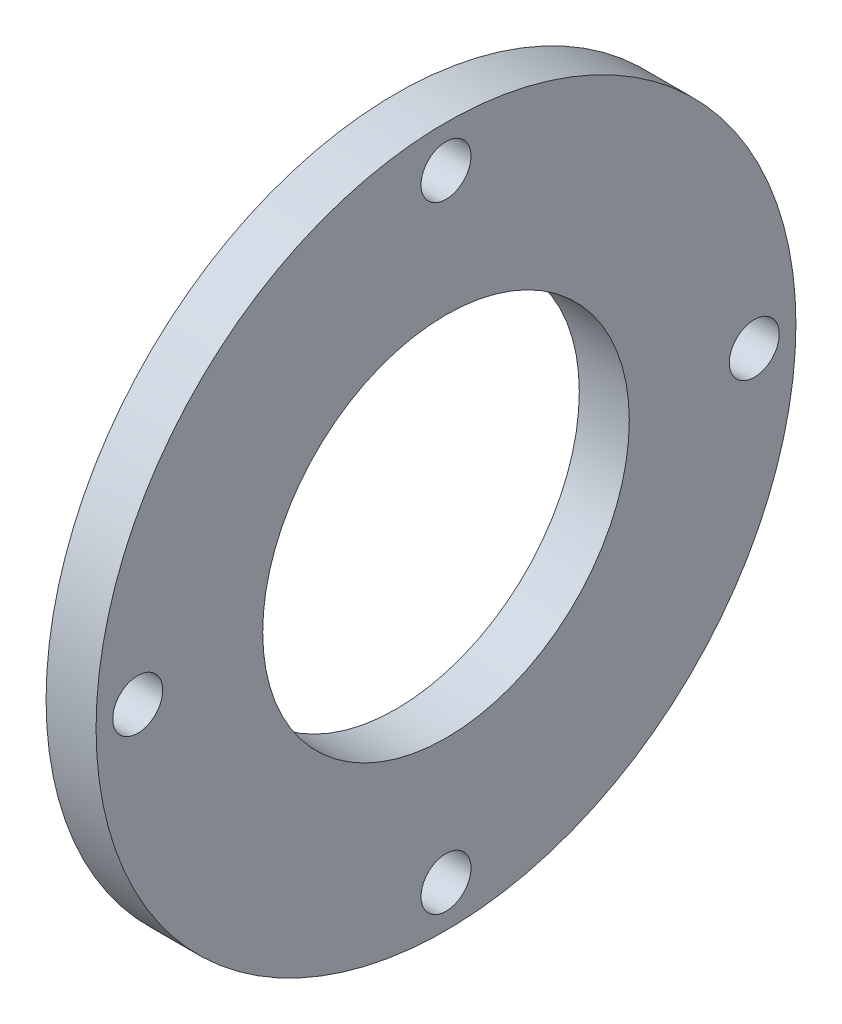
ISO-10303-21;
HEADER;
FILE_DESCRIPTION(('STEP AP214'),'2;1');
FILE_NAME('part.step','',(''),(''),'','','');
FILE_SCHEMA(('AUTOMOTIVE_DESIGN { 1 0 10303 214 1 1 1 1 }'));
ENDSEC;
DATA;
#1=APPLICATION_CONTEXT('core data for automotive mechanical design processes');
#2=APPLICATION_PROTOCOL_DEFINITION('international standard','automotive_design',2000,#1);
#3=PRODUCT_CONTEXT('',#1,'mechanical');
#4=PRODUCT('Part','Part','',(#3));
#5=PRODUCT_RELATED_PRODUCT_CATEGORY('part','',(#4));
#6=PRODUCT_DEFINITION_FORMATION('','',#4);
#7=PRODUCT_DEFINITION_CONTEXT('part definition',#1,'design');
#8=PRODUCT_DEFINITION('design','',#6,#7);
#9=PRODUCT_DEFINITION_SHAPE('','',#8);
#10=(LENGTH_UNIT() NAMED_UNIT(*) SI_UNIT(.MILLI.,.METRE.));
#11=(NAMED_UNIT(*) PLANE_ANGLE_UNIT() SI_UNIT($,.RADIAN.));
#12=(NAMED_UNIT(*) SI_UNIT($,.STERADIAN.) SOLID_ANGLE_UNIT());
#13=UNCERTAINTY_MEASURE_WITH_UNIT(LENGTH_MEASURE(1.E-05),#10,'distance_accuracy_value','');
#14=(GEOMETRIC_REPRESENTATION_CONTEXT(3) GLOBAL_UNCERTAINTY_ASSIGNED_CONTEXT((#13)) GLOBAL_UNIT_ASSIGNED_CONTEXT((#10,
#11,#12)) REPRESENTATION_CONTEXT('',''));
#15=CARTESIAN_POINT('',(0.,0.,0.));
#16=DIRECTION('',(0.,0.,1.));
#17=DIRECTION('',(1.,0.,0.));
#18=AXIS2_PLACEMENT_3D('',#15,#16,#17);
#19=CARTESIAN_POINT('',(3.,0.,0.));
#20=DIRECTION('',(1.,0.,0.));
#21=DIRECTION('',(0.,0.,-1.));
#22=AXIS2_PLACEMENT_3D('',#19,#20,#21);
#23=PLANE('',#22);
#24=CARTESIAN_POINT('',(3.,-18.5,0.));
#25=DIRECTION('',(1.,0.,0.));
#26=DIRECTION('',(0.,0.,-1.));
#27=AXIS2_PLACEMENT_3D('',#24,#25,#26);
#28=CIRCLE('',#27,1.5);
#29=CARTESIAN_POINT('',(3.,-18.5,-1.5));
#30=VERTEX_POINT('',#29);
#31=EDGE_CURVE('E67',#30,#30,#28,.T.);
#32=ORIENTED_EDGE('',*,*,#31,.F.);
#33=EDGE_LOOP('',(#32));
#34=FACE_BOUND('',#33,.T.);
#35=CARTESIAN_POINT('',(3.,18.5,0.));
#36=DIRECTION('',(1.,0.,0.));
#37=DIRECTION('',(0.,0.,-1.));
#38=AXIS2_PLACEMENT_3D('',#35,#36,#37);
#39=CIRCLE('',#38,1.5);
#40=CARTESIAN_POINT('',(3.,18.5,-1.5));
#41=VERTEX_POINT('',#40);
#42=EDGE_CURVE('E55',#41,#41,#39,.T.);
#43=ORIENTED_EDGE('',*,*,#42,.F.);
#44=EDGE_LOOP('',(#43));
#45=FACE_BOUND('',#44,.T.);
#46=CARTESIAN_POINT('',(3.,0.,0.));
#47=DIRECTION('',(1.,0.,0.));
#48=DIRECTION('',(0.,0.,-1.));
#49=AXIS2_PLACEMENT_3D('',#46,#47,#48);
#50=CIRCLE('',#49,21.);
#51=CARTESIAN_POINT('',(3.,0.,-21.));
#52=VERTEX_POINT('',#51);
#53=EDGE_CURVE('E10',#52,#52,#50,.T.);
#54=ORIENTED_EDGE('',*,*,#53,.T.);
#55=EDGE_LOOP('',(#54));
#56=FACE_BOUND('',#55,.T.);
#57=CARTESIAN_POINT('',(3.,0.,0.));
#58=DIRECTION('',(1.,0.,0.));
#59=DIRECTION('',(0.,0.,-1.));
#60=AXIS2_PLACEMENT_3D('',#57,#58,#59);
#61=CIRCLE('',#60,11.);
#62=CARTESIAN_POINT('',(3.,0.,-11.));
#63=VERTEX_POINT('',#62);
#64=EDGE_CURVE('E50',#63,#63,#61,.T.);
#65=ORIENTED_EDGE('',*,*,#64,.F.);
#66=EDGE_LOOP('',(#65));
#67=FACE_BOUND('',#66,.T.);
#68=CARTESIAN_POINT('',(3.,0.,-18.5));
#69=DIRECTION('',(1.,0.,0.));
#70=DIRECTION('',(0.,0.,-1.));
#71=AXIS2_PLACEMENT_3D('',#68,#69,#70);
#72=CIRCLE('',#71,1.5);
#73=CARTESIAN_POINT('',(3.,0.,-20.));
#74=VERTEX_POINT('',#73);
#75=EDGE_CURVE('E61',#74,#74,#72,.T.);
#76=ORIENTED_EDGE('',*,*,#75,.F.);
#77=EDGE_LOOP('',(#76));
#78=FACE_BOUND('',#77,.T.);
#79=CARTESIAN_POINT('',(3.,0.,18.5));
#80=DIRECTION('',(1.,0.,0.));
#81=DIRECTION('',(0.,0.,-1.));
#82=AXIS2_PLACEMENT_3D('',#79,#80,#81);
#83=CIRCLE('',#82,1.5);
#84=CARTESIAN_POINT('',(3.,0.,17.));
#85=VERTEX_POINT('',#84);
#86=EDGE_CURVE('E73',#85,#85,#83,.T.);
#87=ORIENTED_EDGE('',*,*,#86,.F.);
#88=EDGE_LOOP('',(#87));
#89=FACE_BOUND('',#88,.T.);
#90=ADVANCED_FACE('F39',(#34,#45,#56,#67,#78,#89),#23,.T.);
#91=CARTESIAN_POINT('',(0.,0.,0.));
#92=DIRECTION('',(1.,0.,0.));
#93=DIRECTION('',(0.,0.,-1.));
#94=AXIS2_PLACEMENT_3D('',#91,#92,#93);
#95=PLANE('',#94);
#96=CARTESIAN_POINT('',(0.,0.,0.));
#97=DIRECTION('',(1.,0.,0.));
#98=DIRECTION('',(0.,0.,-1.));
#99=AXIS2_PLACEMENT_3D('',#96,#97,#98);
#100=CIRCLE('',#99,21.);
#101=CARTESIAN_POINT('',(0.,0.,-21.));
#102=VERTEX_POINT('',#101);
#103=EDGE_CURVE('E43',#102,#102,#100,.T.);
#104=ORIENTED_EDGE('',*,*,#103,.F.);
#105=EDGE_LOOP('',(#104));
#106=FACE_BOUND('',#105,.T.);
#107=CARTESIAN_POINT('',(0.,0.,0.));
#108=DIRECTION('',(1.,0.,0.));
#109=DIRECTION('',(0.,0.,-1.));
#110=AXIS2_PLACEMENT_3D('',#107,#108,#109);
#111=CIRCLE('',#110,11.);
#112=CARTESIAN_POINT('',(0.,0.,-11.));
#113=VERTEX_POINT('',#112);
#114=EDGE_CURVE('E52',#113,#113,#111,.T.);
#115=ORIENTED_EDGE('',*,*,#114,.T.);
#116=EDGE_LOOP('',(#115));
#117=FACE_BOUND('',#116,.T.);
#118=CARTESIAN_POINT('',(0.,18.5,0.));
#119=DIRECTION('',(1.,0.,0.));
#120=DIRECTION('',(0.,0.,-1.));
#121=AXIS2_PLACEMENT_3D('',#118,#119,#120);
#122=CIRCLE('',#121,1.5);
#123=CARTESIAN_POINT('',(0.,18.5,-1.5));
#124=VERTEX_POINT('',#123);
#125=EDGE_CURVE('E58',#124,#124,#122,.T.);
#126=ORIENTED_EDGE('',*,*,#125,.T.);
#127=EDGE_LOOP('',(#126));
#128=FACE_BOUND('',#127,.T.);
#129=CARTESIAN_POINT('',(0.,0.,-18.5));
#130=DIRECTION('',(1.,0.,0.));
#131=DIRECTION('',(0.,0.,-1.));
#132=AXIS2_PLACEMENT_3D('',#129,#130,#131);
#133=CIRCLE('',#132,1.5);
#134=CARTESIAN_POINT('',(0.,0.,-20.));
#135=VERTEX_POINT('',#134);
#136=EDGE_CURVE('E64',#135,#135,#133,.T.);
#137=ORIENTED_EDGE('',*,*,#136,.T.);
#138=EDGE_LOOP('',(#137));
#139=FACE_BOUND('',#138,.T.);
#140=CARTESIAN_POINT('',(0.,-18.5,0.));
#141=DIRECTION('',(1.,0.,0.));
#142=DIRECTION('',(0.,0.,-1.));
#143=AXIS2_PLACEMENT_3D('',#140,#141,#142);
#144=CIRCLE('',#143,1.5);
#145=CARTESIAN_POINT('',(0.,-18.5,-1.5));
#146=VERTEX_POINT('',#145);
#147=EDGE_CURVE('E70',#146,#146,#144,.T.);
#148=ORIENTED_EDGE('',*,*,#147,.T.);
#149=EDGE_LOOP('',(#148));
#150=FACE_BOUND('',#149,.T.);
#151=CARTESIAN_POINT('',(0.,0.,18.5));
#152=DIRECTION('',(1.,0.,0.));
#153=DIRECTION('',(0.,0.,-1.));
#154=AXIS2_PLACEMENT_3D('',#151,#152,#153);
#155=CIRCLE('',#154,1.5);
#156=CARTESIAN_POINT('',(0.,0.,17.));
#157=VERTEX_POINT('',#156);
#158=EDGE_CURVE('E76',#157,#157,#155,.T.);
#159=ORIENTED_EDGE('',*,*,#158,.T.);
#160=EDGE_LOOP('',(#159));
#161=FACE_BOUND('',#160,.T.);
#162=ADVANCED_FACE('F86',(#106,#117,#128,#139,#150,#161),#95,.F.);
#163=CARTESIAN_POINT('',(3.,0.,0.));
#164=DIRECTION('',(-1.,0.,0.));
#165=DIRECTION('',(0.,0.,1.));
#166=AXIS2_PLACEMENT_3D('',#163,#164,#165);
#167=CYLINDRICAL_SURFACE('',#166,21.);
#168=ORIENTED_EDGE('',*,*,#53,.F.);
#169=EDGE_LOOP('',(#168));
#170=FACE_BOUND('',#169,.T.);
#171=ORIENTED_EDGE('',*,*,#103,.T.);
#172=EDGE_LOOP('',(#171));
#173=FACE_BOUND('',#172,.T.);
#174=ADVANCED_FACE('F41',(#170,#173),#167,.T.);
#175=CARTESIAN_POINT('',(3.,0.,0.));
#176=DIRECTION('',(-1.,0.,0.));
#177=DIRECTION('',(0.,0.,1.));
#178=AXIS2_PLACEMENT_3D('',#175,#176,#177);
#179=CYLINDRICAL_SURFACE('',#178,11.);
#180=ORIENTED_EDGE('',*,*,#64,.T.);
#181=EDGE_LOOP('',(#180));
#182=FACE_BOUND('',#181,.T.);
#183=ORIENTED_EDGE('',*,*,#114,.F.);
#184=EDGE_LOOP('',(#183));
#185=FACE_BOUND('',#184,.T.);
#186=ADVANCED_FACE('F96',(#182,#185),#179,.F.);
#187=CARTESIAN_POINT('',(3.,18.5,0.));
#188=DIRECTION('',(-1.,0.,0.));
#189=DIRECTION('',(0.,0.,1.));
#190=AXIS2_PLACEMENT_3D('',#187,#188,#189);
#191=CYLINDRICAL_SURFACE('',#190,1.5);
#192=ORIENTED_EDGE('',*,*,#42,.T.);
#193=EDGE_LOOP('',(#192));
#194=FACE_BOUND('',#193,.T.);
#195=ORIENTED_EDGE('',*,*,#125,.F.);
#196=EDGE_LOOP('',(#195));
#197=FACE_BOUND('',#196,.T.);
#198=ADVANCED_FACE('F99',(#194,#197),#191,.F.);
#199=CARTESIAN_POINT('',(3.,0.,-18.5));
#200=DIRECTION('',(-1.,0.,0.));
#201=DIRECTION('',(0.,0.,1.));
#202=AXIS2_PLACEMENT_3D('',#199,#200,#201);
#203=CYLINDRICAL_SURFACE('',#202,1.5);
#204=ORIENTED_EDGE('',*,*,#75,.T.);
#205=EDGE_LOOP('',(#204));
#206=FACE_BOUND('',#205,.T.);
#207=ORIENTED_EDGE('',*,*,#136,.F.);
#208=EDGE_LOOP('',(#207));
#209=FACE_BOUND('',#208,.T.);
#210=ADVANCED_FACE('F103',(#206,#209),#203,.F.);
#211=CARTESIAN_POINT('',(3.,-18.5,0.));
#212=DIRECTION('',(-1.,0.,0.));
#213=DIRECTION('',(0.,0.,1.));
#214=AXIS2_PLACEMENT_3D('',#211,#212,#213);
#215=CYLINDRICAL_SURFACE('',#214,1.5);
#216=ORIENTED_EDGE('',*,*,#31,.T.);
#217=EDGE_LOOP('',(#216));
#218=FACE_BOUND('',#217,.T.);
#219=ORIENTED_EDGE('',*,*,#147,.F.);
#220=EDGE_LOOP('',(#219));
#221=FACE_BOUND('',#220,.T.);
#222=ADVANCED_FACE('F107',(#218,#221),#215,.F.);
#223=CARTESIAN_POINT('',(3.,0.,18.5));
#224=DIRECTION('',(-1.,0.,0.));
#225=DIRECTION('',(0.,0.,1.));
#226=AXIS2_PLACEMENT_3D('',#223,#224,#225);
#227=CYLINDRICAL_SURFACE('',#226,1.5);
#228=ORIENTED_EDGE('',*,*,#86,.T.);
#229=EDGE_LOOP('',(#228));
#230=FACE_BOUND('',#229,.T.);
#231=ORIENTED_EDGE('',*,*,#158,.F.);
#232=EDGE_LOOP('',(#231));
#233=FACE_BOUND('',#232,.T.);
#234=ADVANCED_FACE('F82',(#230,#233),#227,.F.);
#235=CLOSED_SHELL('',(#90,#162,#174,#186,#198,#210,#222,#234));
#236=MANIFOLD_SOLID_BREP('B2',#235);
#237=ADVANCED_BREP_SHAPE_REPRESENTATION('',(#18,#236),#14);
#238=SHAPE_DEFINITION_REPRESENTATION(#9,#237);
ENDSEC;
END-ISO-10303-21;
